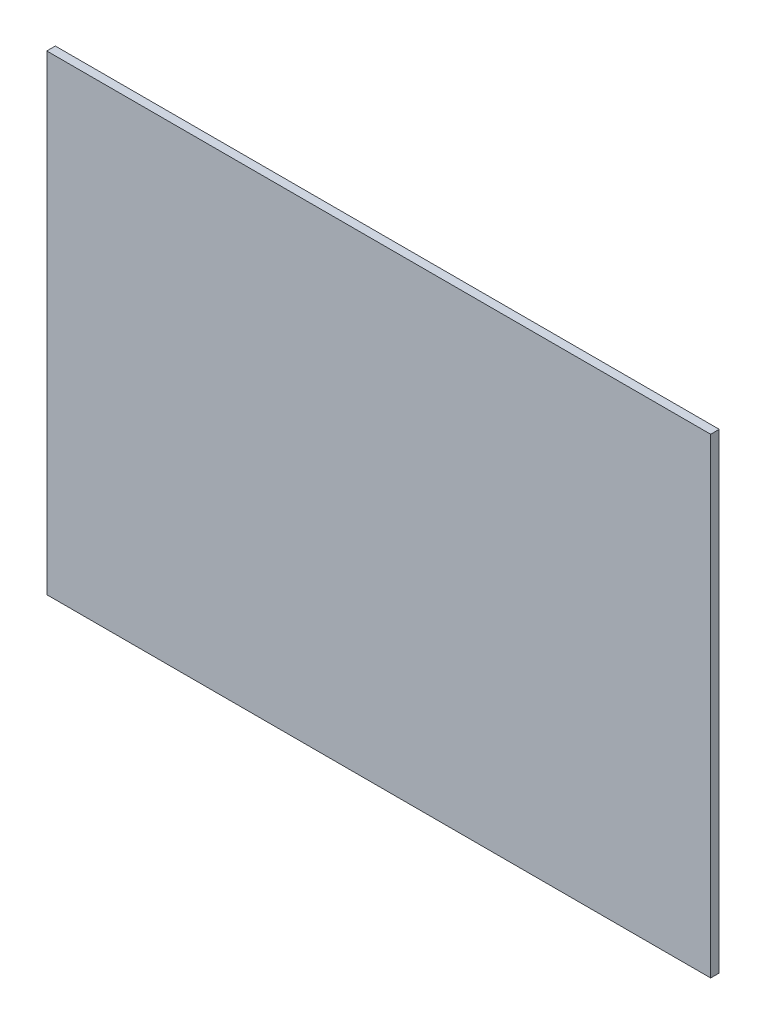
ISO-10303-21;
HEADER;
FILE_DESCRIPTION(('STEP AP214'),'2;1');
FILE_NAME('part.step','',(''),(''),'','','');
FILE_SCHEMA(('AUTOMOTIVE_DESIGN { 1 0 10303 214 1 1 1 1 }'));
ENDSEC;
DATA;
#1=APPLICATION_CONTEXT('core data for automotive mechanical design processes');
#2=APPLICATION_PROTOCOL_DEFINITION('international standard','automotive_design',2000,#1);
#3=PRODUCT_CONTEXT('',#1,'mechanical');
#4=PRODUCT('Part','Part','',(#3));
#5=PRODUCT_RELATED_PRODUCT_CATEGORY('part','',(#4));
#6=PRODUCT_DEFINITION_FORMATION('','',#4);
#7=PRODUCT_DEFINITION_CONTEXT('part definition',#1,'design');
#8=PRODUCT_DEFINITION('design','',#6,#7);
#9=PRODUCT_DEFINITION_SHAPE('','',#8);
#10=(LENGTH_UNIT() NAMED_UNIT(*) SI_UNIT(.MILLI.,.METRE.));
#11=(NAMED_UNIT(*) PLANE_ANGLE_UNIT() SI_UNIT($,.RADIAN.));
#12=(NAMED_UNIT(*) SI_UNIT($,.STERADIAN.) SOLID_ANGLE_UNIT());
#13=UNCERTAINTY_MEASURE_WITH_UNIT(LENGTH_MEASURE(1.E-05),#10,'distance_accuracy_value','');
#14=(GEOMETRIC_REPRESENTATION_CONTEXT(3) GLOBAL_UNCERTAINTY_ASSIGNED_CONTEXT((#13)) GLOBAL_UNIT_ASSIGNED_CONTEXT((#10,
#11,#12)) REPRESENTATION_CONTEXT('',''));
#15=CARTESIAN_POINT('',(0.,0.,0.));
#16=DIRECTION('',(0.,0.,1.));
#17=DIRECTION('',(1.,0.,0.));
#18=AXIS2_PLACEMENT_3D('',#15,#16,#17);
#19=CARTESIAN_POINT('',(-46.1600301871157,-35.3445119393202,0.));
#20=DIRECTION('',(0.,0.,1.));
#21=DIRECTION('',(1.,0.,0.));
#22=AXIS2_PLACEMENT_3D('',#19,#20,#21);
#23=PLANE('',#22);
#24=DIRECTION('',(1.,0.,0.));
#25=VECTOR('',#24,1.);
#26=CARTESIAN_POINT('',(-46.1600301871157,19.6954880606798,0.));
#27=LINE('',#26,#25);
#28=CARTESIAN_POINT('',(-46.1600301871157,19.6954880606798,0.));
#29=VERTEX_POINT('',#28);
#30=CARTESIAN_POINT('',(31.4399698128843,19.6954880606798,0.));
#31=VERTEX_POINT('',#30);
#32=EDGE_CURVE('E80',#29,#31,#27,.T.);
#33=ORIENTED_EDGE('',*,*,#32,.T.);
#34=DIRECTION('',(0.,1.,0.));
#35=VECTOR('',#34,1.);
#36=CARTESIAN_POINT('',(31.4399698128843,19.6954880606798,0.));
#37=LINE('',#36,#35);
#38=CARTESIAN_POINT('',(31.4399698128843,-35.3445119393202,0.));
#39=VERTEX_POINT('',#38);
#40=EDGE_CURVE('E67',#31,#39,#37,.F.);
#41=ORIENTED_EDGE('',*,*,#40,.T.);
#42=DIRECTION('',(-1.,0.,0.));
#43=VECTOR('',#42,1.);
#44=CARTESIAN_POINT('',(-46.1600301871157,-35.3445119393202,0.));
#45=LINE('',#44,#43);
#46=CARTESIAN_POINT('',(-46.1600301871157,-35.3445119393202,0.));
#47=VERTEX_POINT('',#46);
#48=EDGE_CURVE('E54',#39,#47,#45,.T.);
#49=ORIENTED_EDGE('',*,*,#48,.T.);
#50=DIRECTION('',(0.,1.,0.));
#51=VECTOR('',#50,1.);
#52=CARTESIAN_POINT('',(-46.1600301871157,19.6954880606798,0.));
#53=LINE('',#52,#51);
#54=EDGE_CURVE('E19',#47,#29,#53,.T.);
#55=ORIENTED_EDGE('',*,*,#54,.T.);
#56=EDGE_LOOP('',(#33,#41,#49,#55));
#57=FACE_BOUND('',#56,.T.);
#58=ADVANCED_FACE('F16',(#57),#23,.F.);
#59=CARTESIAN_POINT('',(-46.1600301871157,19.6954880606798,1.));
#60=DIRECTION('',(1.,0.,0.));
#61=DIRECTION('',(0.,1.,0.));
#62=AXIS2_PLACEMENT_3D('',#59,#60,#61);
#63=PLANE('',#62);
#64=DIRECTION('',(0.,0.,1.));
#65=VECTOR('',#64,1.);
#66=CARTESIAN_POINT('',(-46.1600301871157,-35.3445119393202,1.));
#67=LINE('',#66,#65);
#68=CARTESIAN_POINT('',(-46.1600301871157,-35.3445119393202,1.));
#69=VERTEX_POINT('',#68);
#70=EDGE_CURVE('E60',#47,#69,#67,.T.);
#71=ORIENTED_EDGE('',*,*,#70,.T.);
#72=DIRECTION('',(0.,1.,0.));
#73=VECTOR('',#72,1.);
#74=CARTESIAN_POINT('',(-46.1600301871157,-35.3445119393202,1.));
#75=LINE('',#74,#73);
#76=CARTESIAN_POINT('',(-46.1600301871157,19.6954880606798,1.));
#77=VERTEX_POINT('',#76);
#78=EDGE_CURVE('E82',#77,#69,#75,.F.);
#79=ORIENTED_EDGE('',*,*,#78,.F.);
#80=DIRECTION('',(0.,0.,-1.));
#81=VECTOR('',#80,1.);
#82=CARTESIAN_POINT('',(-46.1600301871157,19.6954880606798,1.));
#83=LINE('',#82,#81);
#84=EDGE_CURVE('E63',#77,#29,#83,.T.);
#85=ORIENTED_EDGE('',*,*,#84,.T.);
#86=ORIENTED_EDGE('',*,*,#54,.F.);
#87=EDGE_LOOP('',(#71,#79,#85,#86));
#88=FACE_BOUND('',#87,.T.);
#89=ADVANCED_FACE('F59',(#88),#63,.F.);
#90=CARTESIAN_POINT('',(-46.1600301871157,-35.3445119393202,1.));
#91=DIRECTION('',(0.,1.,0.));
#92=DIRECTION('',(-1.,0.,0.));
#93=AXIS2_PLACEMENT_3D('',#90,#91,#92);
#94=PLANE('',#93);
#95=DIRECTION('',(0.,0.,1.));
#96=VECTOR('',#95,1.);
#97=CARTESIAN_POINT('',(31.4399698128843,-35.3445119393202,1.));
#98=LINE('',#97,#96);
#99=CARTESIAN_POINT('',(31.4399698128843,-35.3445119393202,1.));
#100=VERTEX_POINT('',#99);
#101=EDGE_CURVE('E69',#39,#100,#98,.T.);
#102=ORIENTED_EDGE('',*,*,#101,.T.);
#103=DIRECTION('',(1.,0.,0.));
#104=VECTOR('',#103,1.);
#105=CARTESIAN_POINT('',(-46.1600301871157,-35.3445119393202,1.));
#106=LINE('',#105,#104);
#107=EDGE_CURVE('E73',#69,#100,#106,.T.);
#108=ORIENTED_EDGE('',*,*,#107,.F.);
#109=ORIENTED_EDGE('',*,*,#70,.F.);
#110=ORIENTED_EDGE('',*,*,#48,.F.);
#111=EDGE_LOOP('',(#102,#108,#109,#110));
#112=FACE_BOUND('',#111,.T.);
#113=ADVANCED_FACE('F71',(#112),#94,.F.);
#114=CARTESIAN_POINT('',(31.4399698128843,19.6954880606798,1.));
#115=DIRECTION('',(-1.,0.,0.));
#116=DIRECTION('',(0.,0.,1.));
#117=AXIS2_PLACEMENT_3D('',#114,#115,#116);
#118=PLANE('',#117);
#119=DIRECTION('',(0.,0.,-1.));
#120=VECTOR('',#119,1.);
#121=CARTESIAN_POINT('',(31.4399698128843,19.6954880606798,1.));
#122=LINE('',#121,#120);
#123=CARTESIAN_POINT('',(31.4399698128843,19.6954880606798,1.));
#124=VERTEX_POINT('',#123);
#125=EDGE_CURVE('E34',#31,#124,#122,.F.);
#126=ORIENTED_EDGE('',*,*,#125,.T.);
#127=DIRECTION('',(0.,1.,0.));
#128=VECTOR('',#127,1.);
#129=CARTESIAN_POINT('',(31.4399698128843,-35.3445119393202,1.));
#130=LINE('',#129,#128);
#131=EDGE_CURVE('E25',#100,#124,#130,.T.);
#132=ORIENTED_EDGE('',*,*,#131,.F.);
#133=ORIENTED_EDGE('',*,*,#101,.F.);
#134=ORIENTED_EDGE('',*,*,#40,.F.);
#135=EDGE_LOOP('',(#126,#132,#133,#134));
#136=FACE_BOUND('',#135,.T.);
#137=ADVANCED_FACE('F88',(#136),#118,.F.);
#138=CARTESIAN_POINT('',(-46.1600301871157,19.6954880606798,1.));
#139=DIRECTION('',(0.,-1.,0.));
#140=DIRECTION('',(0.,0.,-1.));
#141=AXIS2_PLACEMENT_3D('',#138,#139,#140);
#142=PLANE('',#141);
#143=ORIENTED_EDGE('',*,*,#84,.F.);
#144=DIRECTION('',(1.,0.,0.));
#145=VECTOR('',#144,1.);
#146=CARTESIAN_POINT('',(-46.1600301871157,19.6954880606798,1.));
#147=LINE('',#146,#145);
#148=EDGE_CURVE('E11',#124,#77,#147,.F.);
#149=ORIENTED_EDGE('',*,*,#148,.F.);
#150=ORIENTED_EDGE('',*,*,#125,.F.);
#151=ORIENTED_EDGE('',*,*,#32,.F.);
#152=EDGE_LOOP('',(#143,#149,#150,#151));
#153=FACE_BOUND('',#152,.T.);
#154=ADVANCED_FACE('F90',(#153),#142,.F.);
#155=CARTESIAN_POINT('',(-46.1600301871157,-35.3445119393202,1.));
#156=DIRECTION('',(0.,0.,1.));
#157=DIRECTION('',(1.,0.,0.));
#158=AXIS2_PLACEMENT_3D('',#155,#156,#157);
#159=PLANE('',#158);
#160=ORIENTED_EDGE('',*,*,#131,.T.);
#161=ORIENTED_EDGE('',*,*,#148,.T.);
#162=ORIENTED_EDGE('',*,*,#78,.T.);
#163=ORIENTED_EDGE('',*,*,#107,.T.);
#164=EDGE_LOOP('',(#160,#161,#162,#163));
#165=FACE_BOUND('',#164,.T.);
#166=ADVANCED_FACE('F87',(#165),#159,.T.);
#167=CLOSED_SHELL('',(#58,#89,#113,#137,#154,#166));
#168=MANIFOLD_SOLID_BREP('B1',#167);
#169=ADVANCED_BREP_SHAPE_REPRESENTATION('',(#18,#168),#14);
#170=SHAPE_DEFINITION_REPRESENTATION(#9,#169);
ENDSEC;
END-ISO-10303-21;
